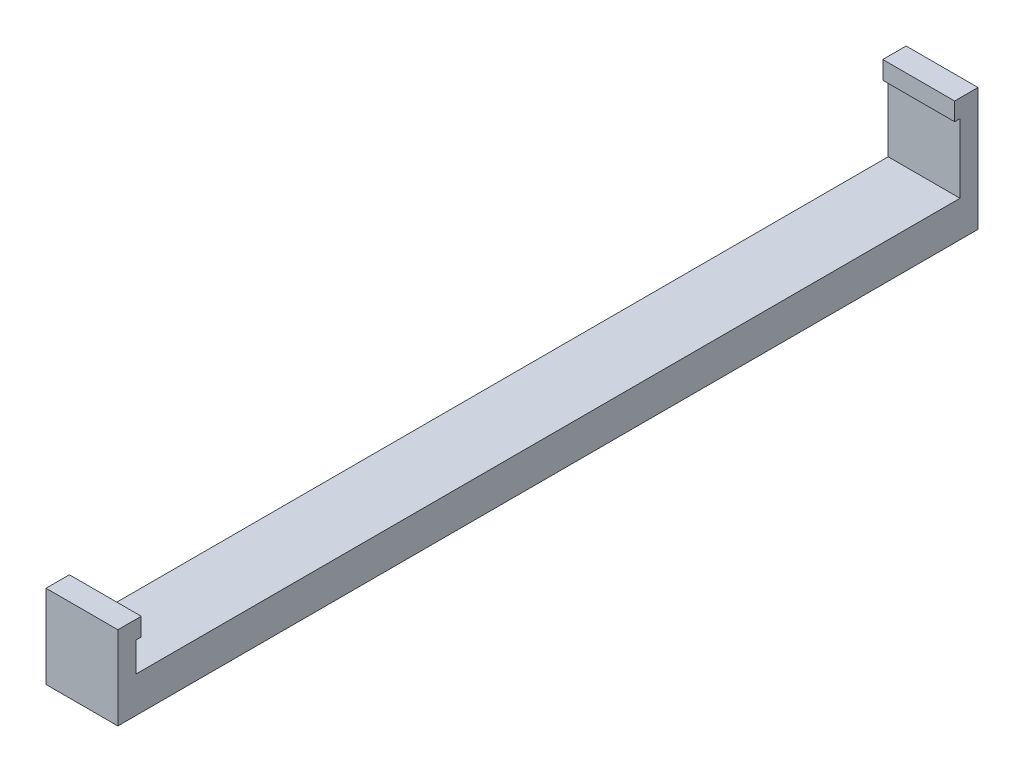
ISO-10303-21;
HEADER;
FILE_DESCRIPTION(('STEP AP214'),'2;1');
FILE_NAME('part.step','',(''),(''),'','','');
FILE_SCHEMA(('AUTOMOTIVE_DESIGN { 1 0 10303 214 1 1 1 1 }'));
ENDSEC;
DATA;
#1=APPLICATION_CONTEXT('core data for automotive mechanical design processes');
#2=APPLICATION_PROTOCOL_DEFINITION('international standard','automotive_design',2000,#1);
#3=PRODUCT_CONTEXT('',#1,'mechanical');
#4=PRODUCT('Part','Part','',(#3));
#5=PRODUCT_RELATED_PRODUCT_CATEGORY('part','',(#4));
#6=PRODUCT_DEFINITION_FORMATION('','',#4);
#7=PRODUCT_DEFINITION_CONTEXT('part definition',#1,'design');
#8=PRODUCT_DEFINITION('design','',#6,#7);
#9=PRODUCT_DEFINITION_SHAPE('','',#8);
#10=(LENGTH_UNIT() NAMED_UNIT(*) SI_UNIT(.MILLI.,.METRE.));
#11=(NAMED_UNIT(*) PLANE_ANGLE_UNIT() SI_UNIT($,.RADIAN.));
#12=(NAMED_UNIT(*) SI_UNIT($,.STERADIAN.) SOLID_ANGLE_UNIT());
#13=UNCERTAINTY_MEASURE_WITH_UNIT(LENGTH_MEASURE(1.E-05),#10,'distance_accuracy_value','');
#14=(GEOMETRIC_REPRESENTATION_CONTEXT(3) GLOBAL_UNCERTAINTY_ASSIGNED_CONTEXT((#13)) GLOBAL_UNIT_ASSIGNED_CONTEXT((#10,
#11,#12)) REPRESENTATION_CONTEXT('',''));
#15=CARTESIAN_POINT('',(0.,0.,0.));
#16=DIRECTION('',(0.,0.,1.));
#17=DIRECTION('',(1.,0.,0.));
#18=AXIS2_PLACEMENT_3D('',#15,#16,#17);
#19=CARTESIAN_POINT('',(10.,5.,0.));
#20=DIRECTION('',(-1.,0.,0.));
#21=DIRECTION('',(0.,0.,1.));
#22=AXIS2_PLACEMENT_3D('',#19,#20,#21);
#23=PLANE('',#22);
#24=DIRECTION('',(0.,0.,-1.));
#25=VECTOR('',#24,1.);
#26=CARTESIAN_POINT('',(10.,0.,0.));
#27=LINE('',#26,#25);
#28=CARTESIAN_POINT('',(10.,0.,2.5));
#29=VERTEX_POINT('',#28);
#30=CARTESIAN_POINT('',(9.99999999999998,0.,-117.18));
#31=VERTEX_POINT('',#30);
#32=EDGE_CURVE('E137',#29,#31,#27,.T.);
#33=ORIENTED_EDGE('',*,*,#32,.T.);
#34=DIRECTION('',(0.,1.,0.));
#35=VECTOR('',#34,1.);
#36=CARTESIAN_POINT('',(9.99999999999998,14.6,-117.18));
#37=LINE('',#36,#35);
#38=CARTESIAN_POINT('',(9.99999999999998,17.1,-117.18));
#39=VERTEX_POINT('',#38);
#40=EDGE_CURVE('E144',#31,#39,#37,.T.);
#41=ORIENTED_EDGE('',*,*,#40,.T.);
#42=DIRECTION('',(0.,0.,1.));
#43=VECTOR('',#42,1.);
#44=CARTESIAN_POINT('',(9.99999999999998,17.1,-117.18));
#45=LINE('',#44,#43);
#46=CARTESIAN_POINT('',(9.99999999999998,17.1,-113.93));
#47=VERTEX_POINT('',#46);
#48=EDGE_CURVE('E177',#39,#47,#45,.T.);
#49=ORIENTED_EDGE('',*,*,#48,.T.);
#50=DIRECTION('',(0.,-1.,0.));
#51=VECTOR('',#50,1.);
#52=CARTESIAN_POINT('',(9.99999999999998,14.6,-113.93));
#53=LINE('',#52,#51);
#54=CARTESIAN_POINT('',(9.99999999999998,14.6,-113.93));
#55=VERTEX_POINT('',#54);
#56=EDGE_CURVE('E181',#47,#55,#53,.T.);
#57=ORIENTED_EDGE('',*,*,#56,.T.);
#58=DIRECTION('',(0.,0.,-1.));
#59=VECTOR('',#58,1.);
#60=CARTESIAN_POINT('',(9.99999999999998,14.6,-113.93));
#61=LINE('',#60,#59);
#62=CARTESIAN_POINT('',(9.99999999999998,14.6,-114.68));
#63=VERTEX_POINT('',#62);
#64=EDGE_CURVE('E162',#55,#63,#61,.T.);
#65=ORIENTED_EDGE('',*,*,#64,.T.);
#66=DIRECTION('',(0.,-1.,0.));
#67=VECTOR('',#66,1.);
#68=CARTESIAN_POINT('',(9.99999999999998,0.,-114.68));
#69=LINE('',#68,#67);
#70=CARTESIAN_POINT('',(9.99999999999998,5.,-114.68));
#71=VERTEX_POINT('',#70);
#72=EDGE_CURVE('E171',#63,#71,#69,.T.);
#73=ORIENTED_EDGE('',*,*,#72,.T.);
#74=DIRECTION('',(0.,0.,-1.));
#75=VECTOR('',#74,1.);
#76=CARTESIAN_POINT('',(10.,5.,0.));
#77=LINE('',#76,#75);
#78=CARTESIAN_POINT('',(10.,5.,0.));
#79=VERTEX_POINT('',#78);
#80=EDGE_CURVE('E254',#79,#71,#77,.T.);
#81=ORIENTED_EDGE('',*,*,#80,.F.);
#82=DIRECTION('',(0.,1.,0.));
#83=VECTOR('',#82,1.);
#84=CARTESIAN_POINT('',(10.,0.,0.));
#85=LINE('',#84,#83);
#86=CARTESIAN_POINT('',(10.,9.1,0.));
#87=VERTEX_POINT('',#86);
#88=EDGE_CURVE('E191',#79,#87,#85,.T.);
#89=ORIENTED_EDGE('',*,*,#88,.T.);
#90=DIRECTION('',(0.,0.,-1.));
#91=VECTOR('',#90,1.);
#92=CARTESIAN_POINT('',(10.,9.1,-0.750000000000002));
#93=LINE('',#92,#91);
#94=CARTESIAN_POINT('',(10.,9.1,-0.750000000000002));
#95=VERTEX_POINT('',#94);
#96=EDGE_CURVE('E222',#87,#95,#93,.T.);
#97=ORIENTED_EDGE('',*,*,#96,.T.);
#98=DIRECTION('',(0.,1.,0.));
#99=VECTOR('',#98,1.);
#100=CARTESIAN_POINT('',(10.,9.1,-0.750000000000002));
#101=LINE('',#100,#99);
#102=CARTESIAN_POINT('',(10.,11.6,-0.750000000000002));
#103=VERTEX_POINT('',#102);
#104=EDGE_CURVE('E226',#95,#103,#101,.T.);
#105=ORIENTED_EDGE('',*,*,#104,.T.);
#106=DIRECTION('',(0.,0.,1.));
#107=VECTOR('',#106,1.);
#108=CARTESIAN_POINT('',(10.,11.6,2.5));
#109=LINE('',#108,#107);
#110=CARTESIAN_POINT('',(10.,11.6,2.5));
#111=VERTEX_POINT('',#110);
#112=EDGE_CURVE('E230',#103,#111,#109,.T.);
#113=ORIENTED_EDGE('',*,*,#112,.T.);
#114=DIRECTION('',(0.,-1.,0.));
#115=VECTOR('',#114,1.);
#116=CARTESIAN_POINT('',(10.,0.,2.5));
#117=LINE('',#116,#115);
#118=EDGE_CURVE('E204',#111,#29,#117,.T.);
#119=ORIENTED_EDGE('',*,*,#118,.T.);
#120=EDGE_LOOP('',(#33,#41,#49,#57,#65,#73,#81,#89,#97,#105,#113,#119));
#121=FACE_BOUND('',#120,.T.);
#122=ADVANCED_FACE('F39',(#121),#23,.F.);
#123=CARTESIAN_POINT('',(0.,5.,0.));
#124=DIRECTION('',(1.,0.,0.));
#125=DIRECTION('',(0.,0.,-1.));
#126=AXIS2_PLACEMENT_3D('',#123,#124,#125);
#127=PLANE('',#126);
#128=DIRECTION('',(0.,0.,1.));
#129=VECTOR('',#128,1.);
#130=CARTESIAN_POINT('',(0.,0.,0.));
#131=LINE('',#130,#129);
#132=CARTESIAN_POINT('',(0.,0.,-117.18));
#133=VERTEX_POINT('',#132);
#134=CARTESIAN_POINT('',(0.,0.,2.5));
#135=VERTEX_POINT('',#134);
#136=EDGE_CURVE('E42',#133,#135,#131,.T.);
#137=ORIENTED_EDGE('',*,*,#136,.T.);
#138=DIRECTION('',(0.,-1.,0.));
#139=VECTOR('',#138,1.);
#140=CARTESIAN_POINT('',(0.,9.1,2.5));
#141=LINE('',#140,#139);
#142=CARTESIAN_POINT('',(0.,11.6,2.5));
#143=VERTEX_POINT('',#142);
#144=EDGE_CURVE('E216',#143,#135,#141,.T.);
#145=ORIENTED_EDGE('',*,*,#144,.F.);
#146=DIRECTION('',(0.,0.,1.));
#147=VECTOR('',#146,1.);
#148=CARTESIAN_POINT('',(0.,11.6,2.5));
#149=LINE('',#148,#147);
#150=CARTESIAN_POINT('',(0.,11.6,-0.75));
#151=VERTEX_POINT('',#150);
#152=EDGE_CURVE('E212',#151,#143,#149,.T.);
#153=ORIENTED_EDGE('',*,*,#152,.F.);
#154=DIRECTION('',(0.,1.,0.));
#155=VECTOR('',#154,1.);
#156=CARTESIAN_POINT('',(0.,9.1,-0.75));
#157=LINE('',#156,#155);
#158=CARTESIAN_POINT('',(0.,9.1,-0.75));
#159=VERTEX_POINT('',#158);
#160=EDGE_CURVE('E208',#159,#151,#157,.T.);
#161=ORIENTED_EDGE('',*,*,#160,.F.);
#162=DIRECTION('',(0.,0.,-1.));
#163=VECTOR('',#162,1.);
#164=CARTESIAN_POINT('',(0.,9.1,-0.75));
#165=LINE('',#164,#163);
#166=CARTESIAN_POINT('',(0.,9.1,0.));
#167=VERTEX_POINT('',#166);
#168=EDGE_CURVE('E203',#167,#159,#165,.T.);
#169=ORIENTED_EDGE('',*,*,#168,.F.);
#170=DIRECTION('',(0.,1.,0.));
#171=VECTOR('',#170,1.);
#172=CARTESIAN_POINT('',(0.,0.,0.));
#173=LINE('',#172,#171);
#174=CARTESIAN_POINT('',(0.,5.,0.));
#175=VERTEX_POINT('',#174);
#176=EDGE_CURVE('E200',#175,#167,#173,.T.);
#177=ORIENTED_EDGE('',*,*,#176,.F.);
#178=DIRECTION('',(0.,0.,1.));
#179=VECTOR('',#178,1.);
#180=CARTESIAN_POINT('',(0.,5.,0.));
#181=LINE('',#180,#179);
#182=CARTESIAN_POINT('',(0.,5.,-114.68));
#183=VERTEX_POINT('',#182);
#184=EDGE_CURVE('E11',#183,#175,#181,.T.);
#185=ORIENTED_EDGE('',*,*,#184,.F.);
#186=DIRECTION('',(0.,-1.,0.));
#187=VECTOR('',#186,1.);
#188=CARTESIAN_POINT('',(0.,0.,-114.68));
#189=LINE('',#188,#187);
#190=CARTESIAN_POINT('',(0.,14.6,-114.68));
#191=VERTEX_POINT('',#190);
#192=EDGE_CURVE('E155',#191,#183,#189,.T.);
#193=ORIENTED_EDGE('',*,*,#192,.F.);
#194=DIRECTION('',(0.,0.,-1.));
#195=VECTOR('',#194,1.);
#196=CARTESIAN_POINT('',(0.,14.6,-113.93));
#197=LINE('',#196,#195);
#198=CARTESIAN_POINT('',(0.,14.6,-113.93));
#199=VERTEX_POINT('',#198);
#200=EDGE_CURVE('E147',#199,#191,#197,.T.);
#201=ORIENTED_EDGE('',*,*,#200,.F.);
#202=DIRECTION('',(0.,-1.,0.));
#203=VECTOR('',#202,1.);
#204=CARTESIAN_POINT('',(0.,14.6,-113.93));
#205=LINE('',#204,#203);
#206=CARTESIAN_POINT('',(0.,17.1,-113.93));
#207=VERTEX_POINT('',#206);
#208=EDGE_CURVE('E159',#207,#199,#205,.T.);
#209=ORIENTED_EDGE('',*,*,#208,.F.);
#210=DIRECTION('',(0.,0.,1.));
#211=VECTOR('',#210,1.);
#212=CARTESIAN_POINT('',(0.,17.1,-117.18));
#213=LINE('',#212,#211);
#214=CARTESIAN_POINT('',(0.,17.1,-117.18));
#215=VERTEX_POINT('',#214);
#216=EDGE_CURVE('E153',#215,#207,#213,.T.);
#217=ORIENTED_EDGE('',*,*,#216,.F.);
#218=DIRECTION('',(0.,1.,0.));
#219=VECTOR('',#218,1.);
#220=CARTESIAN_POINT('',(0.,0.,-117.18));
#221=LINE('',#220,#219);
#222=EDGE_CURVE('E141',#133,#215,#221,.T.);
#223=ORIENTED_EDGE('',*,*,#222,.F.);
#224=EDGE_LOOP('',(#137,#145,#153,#161,#169,#177,#185,#193,#201,#209,#217,#223));
#225=FACE_BOUND('',#224,.T.);
#226=ADVANCED_FACE('F150',(#225),#127,.F.);
#227=CARTESIAN_POINT('',(0.,5.,0.));
#228=DIRECTION('',(0.,1.,0.));
#229=DIRECTION('',(0.,0.,1.));
#230=AXIS2_PLACEMENT_3D('',#227,#228,#229);
#231=PLANE('',#230);
#232=DIRECTION('',(1.,0.,0.));
#233=VECTOR('',#232,1.);
#234=CARTESIAN_POINT('',(0.,5.,0.));
#235=LINE('',#234,#233);
#236=EDGE_CURVE('E136',#175,#79,#235,.T.);
#237=ORIENTED_EDGE('',*,*,#236,.T.);
#238=ORIENTED_EDGE('',*,*,#80,.T.);
#239=DIRECTION('',(-1.,0.,0.));
#240=VECTOR('',#239,1.);
#241=CARTESIAN_POINT('',(0.,5.,-114.68));
#242=LINE('',#241,#240);
#243=EDGE_CURVE('E48',#71,#183,#242,.T.);
#244=ORIENTED_EDGE('',*,*,#243,.T.);
#245=ORIENTED_EDGE('',*,*,#184,.T.);
#246=EDGE_LOOP('',(#237,#238,#244,#245));
#247=FACE_BOUND('',#246,.T.);
#248=ADVANCED_FACE('F305',(#247),#231,.T.);
#249=CARTESIAN_POINT('',(0.,0.,0.));
#250=DIRECTION('',(0.,1.,0.));
#251=DIRECTION('',(0.,0.,1.));
#252=AXIS2_PLACEMENT_3D('',#249,#250,#251);
#253=PLANE('',#252);
#254=ORIENTED_EDGE('',*,*,#32,.F.);
#255=DIRECTION('',(1.,0.,0.));
#256=VECTOR('',#255,1.);
#257=CARTESIAN_POINT('',(0.,0.,2.5));
#258=LINE('',#257,#256);
#259=EDGE_CURVE('E130',#135,#29,#258,.T.);
#260=ORIENTED_EDGE('',*,*,#259,.F.);
#261=ORIENTED_EDGE('',*,*,#136,.F.);
#262=DIRECTION('',(1.,0.,0.));
#263=VECTOR('',#262,1.);
#264=CARTESIAN_POINT('',(0.,0.,-117.18));
#265=LINE('',#264,#263);
#266=EDGE_CURVE('E128',#133,#31,#265,.T.);
#267=ORIENTED_EDGE('',*,*,#266,.T.);
#268=EDGE_LOOP('',(#254,#260,#261,#267));
#269=FACE_BOUND('',#268,.T.);
#270=ADVANCED_FACE('F127',(#269),#253,.F.);
#271=CARTESIAN_POINT('',(0.,0.,0.));
#272=DIRECTION('',(0.,0.,-1.));
#273=DIRECTION('',(-1.,0.,0.));
#274=AXIS2_PLACEMENT_3D('',#271,#272,#273);
#275=PLANE('',#274);
#276=ORIENTED_EDGE('',*,*,#88,.F.);
#277=ORIENTED_EDGE('',*,*,#236,.F.);
#278=ORIENTED_EDGE('',*,*,#176,.T.);
#279=DIRECTION('',(1.,0.,0.));
#280=VECTOR('',#279,1.);
#281=CARTESIAN_POINT('',(0.,9.1,0.));
#282=LINE('',#281,#280);
#283=EDGE_CURVE('E219',#167,#87,#282,.T.);
#284=ORIENTED_EDGE('',*,*,#283,.T.);
#285=EDGE_LOOP('',(#276,#277,#278,#284));
#286=FACE_BOUND('',#285,.T.);
#287=ADVANCED_FACE('F278',(#286),#275,.T.);
#288=CARTESIAN_POINT('',(0.,0.,2.5));
#289=DIRECTION('',(0.,0.,1.));
#290=DIRECTION('',(1.,0.,0.));
#291=AXIS2_PLACEMENT_3D('',#288,#289,#290);
#292=PLANE('',#291);
#293=ORIENTED_EDGE('',*,*,#118,.F.);
#294=DIRECTION('',(1.,0.,0.));
#295=VECTOR('',#294,1.);
#296=CARTESIAN_POINT('',(0.,11.6,2.5));
#297=LINE('',#296,#295);
#298=EDGE_CURVE('E239',#143,#111,#297,.T.);
#299=ORIENTED_EDGE('',*,*,#298,.F.);
#300=ORIENTED_EDGE('',*,*,#144,.T.);
#301=ORIENTED_EDGE('',*,*,#259,.T.);
#302=EDGE_LOOP('',(#293,#299,#300,#301));
#303=FACE_BOUND('',#302,.T.);
#304=ADVANCED_FACE('F261',(#303),#292,.T.);
#305=CARTESIAN_POINT('',(0.,11.6,2.5));
#306=DIRECTION('',(0.,1.,0.));
#307=DIRECTION('',(0.,0.,1.));
#308=AXIS2_PLACEMENT_3D('',#305,#306,#307);
#309=PLANE('',#308);
#310=ORIENTED_EDGE('',*,*,#112,.F.);
#311=DIRECTION('',(1.,0.,0.));
#312=VECTOR('',#311,1.);
#313=CARTESIAN_POINT('',(0.,11.6,-0.75));
#314=LINE('',#313,#312);
#315=EDGE_CURVE('E243',#151,#103,#314,.T.);
#316=ORIENTED_EDGE('',*,*,#315,.F.);
#317=ORIENTED_EDGE('',*,*,#152,.T.);
#318=ORIENTED_EDGE('',*,*,#298,.T.);
#319=EDGE_LOOP('',(#310,#316,#317,#318));
#320=FACE_BOUND('',#319,.T.);
#321=ADVANCED_FACE('F266',(#320),#309,.T.);
#322=CARTESIAN_POINT('',(0.,9.1,-0.75));
#323=DIRECTION('',(0.,0.,-1.));
#324=DIRECTION('',(-1.,0.,0.));
#325=AXIS2_PLACEMENT_3D('',#322,#323,#324);
#326=PLANE('',#325);
#327=ORIENTED_EDGE('',*,*,#104,.F.);
#328=DIRECTION('',(1.,0.,0.));
#329=VECTOR('',#328,1.);
#330=CARTESIAN_POINT('',(0.,9.1,-0.75));
#331=LINE('',#330,#329);
#332=EDGE_CURVE('E246',#159,#95,#331,.T.);
#333=ORIENTED_EDGE('',*,*,#332,.F.);
#334=ORIENTED_EDGE('',*,*,#160,.T.);
#335=ORIENTED_EDGE('',*,*,#315,.T.);
#336=EDGE_LOOP('',(#327,#333,#334,#335));
#337=FACE_BOUND('',#336,.T.);
#338=ADVANCED_FACE('F269',(#337),#326,.T.);
#339=CARTESIAN_POINT('',(0.,9.1,-0.75));
#340=DIRECTION('',(0.,-1.,0.));
#341=DIRECTION('',(0.,0.,-1.));
#342=AXIS2_PLACEMENT_3D('',#339,#340,#341);
#343=PLANE('',#342);
#344=ORIENTED_EDGE('',*,*,#96,.F.);
#345=ORIENTED_EDGE('',*,*,#283,.F.);
#346=ORIENTED_EDGE('',*,*,#168,.T.);
#347=ORIENTED_EDGE('',*,*,#332,.T.);
#348=EDGE_LOOP('',(#344,#345,#346,#347));
#349=FACE_BOUND('',#348,.T.);
#350=ADVANCED_FACE('F275',(#349),#343,.T.);
#351=CARTESIAN_POINT('',(0.,0.,-114.68));
#352=DIRECTION('',(0.,0.,1.));
#353=DIRECTION('',(1.,0.,0.));
#354=AXIS2_PLACEMENT_3D('',#351,#352,#353);
#355=PLANE('',#354);
#356=ORIENTED_EDGE('',*,*,#192,.T.);
#357=ORIENTED_EDGE('',*,*,#243,.F.);
#358=ORIENTED_EDGE('',*,*,#72,.F.);
#359=DIRECTION('',(1.,0.,0.));
#360=VECTOR('',#359,1.);
#361=CARTESIAN_POINT('',(0.,14.6,-114.68));
#362=LINE('',#361,#360);
#363=EDGE_CURVE('E188',#191,#63,#362,.T.);
#364=ORIENTED_EDGE('',*,*,#363,.F.);
#365=EDGE_LOOP('',(#356,#357,#358,#364));
#366=FACE_BOUND('',#365,.T.);
#367=ADVANCED_FACE('F282',(#366),#355,.T.);
#368=CARTESIAN_POINT('',(0.,14.6,-113.93));
#369=DIRECTION('',(0.,-1.,0.));
#370=DIRECTION('',(0.,0.,-1.));
#371=AXIS2_PLACEMENT_3D('',#368,#369,#370);
#372=PLANE('',#371);
#373=ORIENTED_EDGE('',*,*,#64,.F.);
#374=DIRECTION('',(1.,0.,0.));
#375=VECTOR('',#374,1.);
#376=CARTESIAN_POINT('',(0.,14.6,-113.93));
#377=LINE('',#376,#375);
#378=EDGE_CURVE('E192',#199,#55,#377,.T.);
#379=ORIENTED_EDGE('',*,*,#378,.F.);
#380=ORIENTED_EDGE('',*,*,#200,.T.);
#381=ORIENTED_EDGE('',*,*,#363,.T.);
#382=EDGE_LOOP('',(#373,#379,#380,#381));
#383=FACE_BOUND('',#382,.T.);
#384=ADVANCED_FACE('F286',(#383),#372,.T.);
#385=CARTESIAN_POINT('',(0.,14.6,-113.93));
#386=DIRECTION('',(0.,0.,1.));
#387=DIRECTION('',(1.,0.,0.));
#388=AXIS2_PLACEMENT_3D('',#385,#386,#387);
#389=PLANE('',#388);
#390=ORIENTED_EDGE('',*,*,#56,.F.);
#391=DIRECTION('',(1.,0.,0.));
#392=VECTOR('',#391,1.);
#393=CARTESIAN_POINT('',(0.,17.1,-113.93));
#394=LINE('',#393,#392);
#395=EDGE_CURVE('E195',#207,#47,#394,.T.);
#396=ORIENTED_EDGE('',*,*,#395,.F.);
#397=ORIENTED_EDGE('',*,*,#208,.T.);
#398=ORIENTED_EDGE('',*,*,#378,.T.);
#399=EDGE_LOOP('',(#390,#396,#397,#398));
#400=FACE_BOUND('',#399,.T.);
#401=ADVANCED_FACE('F292',(#400),#389,.T.);
#402=CARTESIAN_POINT('',(0.,17.1,-117.18));
#403=DIRECTION('',(0.,1.,0.));
#404=DIRECTION('',(0.,0.,1.));
#405=AXIS2_PLACEMENT_3D('',#402,#403,#404);
#406=PLANE('',#405);
#407=ORIENTED_EDGE('',*,*,#48,.F.);
#408=DIRECTION('',(1.,0.,0.));
#409=VECTOR('',#408,1.);
#410=CARTESIAN_POINT('',(0.,17.1,-117.18));
#411=LINE('',#410,#409);
#412=EDGE_CURVE('E146',#215,#39,#411,.T.);
#413=ORIENTED_EDGE('',*,*,#412,.F.);
#414=ORIENTED_EDGE('',*,*,#216,.T.);
#415=ORIENTED_EDGE('',*,*,#395,.T.);
#416=EDGE_LOOP('',(#407,#413,#414,#415));
#417=FACE_BOUND('',#416,.T.);
#418=ADVANCED_FACE('F290',(#417),#406,.T.);
#419=CARTESIAN_POINT('',(0.,14.6,-117.18));
#420=DIRECTION('',(0.,0.,-1.));
#421=DIRECTION('',(0.,1.,0.));
#422=AXIS2_PLACEMENT_3D('',#419,#420,#421);
#423=PLANE('',#422);
#424=ORIENTED_EDGE('',*,*,#40,.F.);
#425=ORIENTED_EDGE('',*,*,#266,.F.);
#426=ORIENTED_EDGE('',*,*,#222,.T.);
#427=ORIENTED_EDGE('',*,*,#412,.T.);
#428=EDGE_LOOP('',(#424,#425,#426,#427));
#429=FACE_BOUND('',#428,.T.);
#430=ADVANCED_FACE('F140',(#429),#423,.T.);
#431=CLOSED_SHELL('',(#122,#226,#248,#270,#287,#304,#321,#338,#350,#367,#384,#401,#418,#430));
#432=MANIFOLD_SOLID_BREP('B2',#431);
#433=ADVANCED_BREP_SHAPE_REPRESENTATION('',(#18,#432),#14);
#434=SHAPE_DEFINITION_REPRESENTATION(#9,#433);
ENDSEC;
END-ISO-10303-21;
